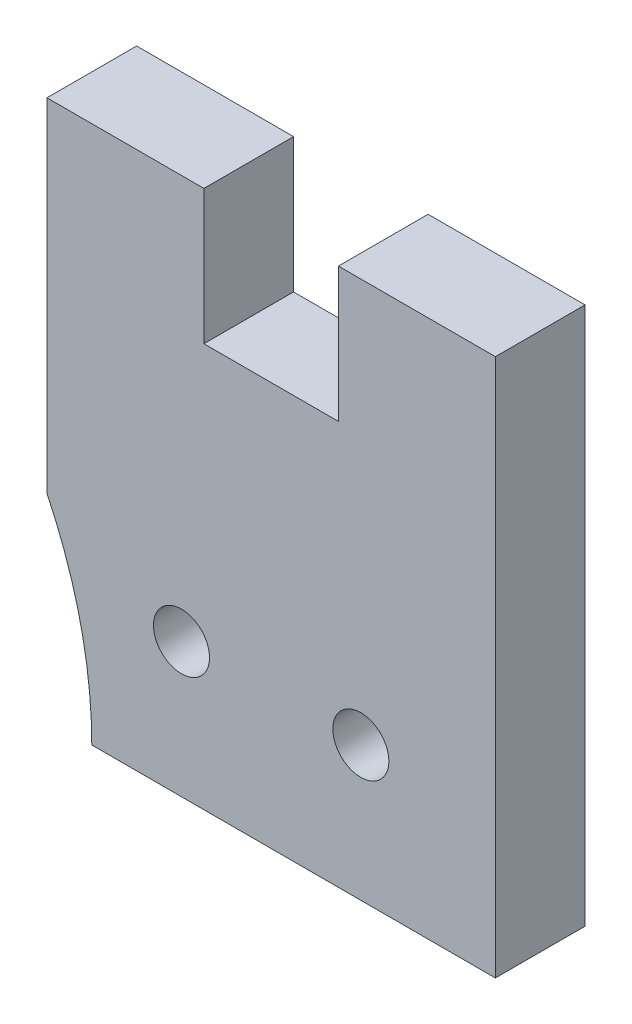
ISO-10303-21;
HEADER;
FILE_DESCRIPTION(('STEP AP214'),'2;1');
FILE_NAME('part.step','',(''),(''),'','','');
FILE_SCHEMA(('AUTOMOTIVE_DESIGN { 1 0 10303 214 1 1 1 1 }'));
ENDSEC;
DATA;
#1=APPLICATION_CONTEXT('core data for automotive mechanical design processes');
#2=APPLICATION_PROTOCOL_DEFINITION('international standard','automotive_design',2000,#1);
#3=PRODUCT_CONTEXT('',#1,'mechanical');
#4=PRODUCT('Part','Part','',(#3));
#5=PRODUCT_RELATED_PRODUCT_CATEGORY('part','',(#4));
#6=PRODUCT_DEFINITION_FORMATION('','',#4);
#7=PRODUCT_DEFINITION_CONTEXT('part definition',#1,'design');
#8=PRODUCT_DEFINITION('design','',#6,#7);
#9=PRODUCT_DEFINITION_SHAPE('','',#8);
#10=(LENGTH_UNIT() NAMED_UNIT(*) SI_UNIT(.MILLI.,.METRE.));
#11=(NAMED_UNIT(*) PLANE_ANGLE_UNIT() SI_UNIT($,.RADIAN.));
#12=(NAMED_UNIT(*) SI_UNIT($,.STERADIAN.) SOLID_ANGLE_UNIT());
#13=UNCERTAINTY_MEASURE_WITH_UNIT(LENGTH_MEASURE(1.E-05),#10,'distance_accuracy_value','');
#14=(GEOMETRIC_REPRESENTATION_CONTEXT(3) GLOBAL_UNCERTAINTY_ASSIGNED_CONTEXT((#13)) GLOBAL_UNIT_ASSIGNED_CONTEXT((#10,
#11,#12)) REPRESENTATION_CONTEXT('',''));
#15=CARTESIAN_POINT('',(0.,0.,0.));
#16=DIRECTION('',(0.,0.,1.));
#17=DIRECTION('',(1.,0.,0.));
#18=AXIS2_PLACEMENT_3D('',#15,#16,#17);
#19=CARTESIAN_POINT('',(2.5,9.,-1.));
#20=DIRECTION('',(1.,0.,0.));
#21=DIRECTION('',(0.,0.,-1.));
#22=AXIS2_PLACEMENT_3D('',#19,#20,#21);
#23=PLANE('',#22);
#24=DIRECTION('',(0.,0.,1.));
#25=VECTOR('',#24,1.);
#26=CARTESIAN_POINT('',(2.5,12.,-1.));
#27=LINE('',#26,#25);
#28=CARTESIAN_POINT('',(2.5,12.,-1.));
#29=VERTEX_POINT('',#28);
#30=CARTESIAN_POINT('',(2.5,12.,0.999999999999997));
#31=VERTEX_POINT('',#30);
#32=EDGE_CURVE('E36',#29,#31,#27,.T.);
#33=ORIENTED_EDGE('',*,*,#32,.T.);
#34=DIRECTION('',(0.,1.,0.));
#35=VECTOR('',#34,1.);
#36=CARTESIAN_POINT('',(2.5,9.,0.999999999999997));
#37=LINE('',#36,#35);
#38=CARTESIAN_POINT('',(2.5,9.,0.999999999999997));
#39=VERTEX_POINT('',#38);
#40=EDGE_CURVE('E103',#39,#31,#37,.T.);
#41=ORIENTED_EDGE('',*,*,#40,.F.);
#42=DIRECTION('',(0.,0.,1.));
#43=VECTOR('',#42,1.);
#44=CARTESIAN_POINT('',(2.5,9.,-1.));
#45=LINE('',#44,#43);
#46=CARTESIAN_POINT('',(2.5,9.,-1.));
#47=VERTEX_POINT('',#46);
#48=EDGE_CURVE('E11',#47,#39,#45,.T.);
#49=ORIENTED_EDGE('',*,*,#48,.F.);
#50=DIRECTION('',(0.,1.,0.));
#51=VECTOR('',#50,1.);
#52=CARTESIAN_POINT('',(2.5,9.,-1.));
#53=LINE('',#52,#51);
#54=EDGE_CURVE('E104',#47,#29,#53,.T.);
#55=ORIENTED_EDGE('',*,*,#54,.T.);
#56=EDGE_LOOP('',(#33,#41,#49,#55));
#57=FACE_BOUND('',#56,.T.);
#58=ADVANCED_FACE('F33',(#57),#23,.T.);
#59=CARTESIAN_POINT('',(5.5,9.,-1.));
#60=DIRECTION('',(0.,1.,0.));
#61=DIRECTION('',(0.,0.,1.));
#62=AXIS2_PLACEMENT_3D('',#59,#60,#61);
#63=PLANE('',#62);
#64=ORIENTED_EDGE('',*,*,#48,.T.);
#65=DIRECTION('',(-1.,0.,0.));
#66=VECTOR('',#65,1.);
#67=CARTESIAN_POINT('',(5.5,9.,0.999999999999997));
#68=LINE('',#67,#66);
#69=CARTESIAN_POINT('',(5.5,9.,0.999999999999997));
#70=VERTEX_POINT('',#69);
#71=EDGE_CURVE('E121',#70,#39,#68,.T.);
#72=ORIENTED_EDGE('',*,*,#71,.F.);
#73=DIRECTION('',(0.,0.,1.));
#74=VECTOR('',#73,1.);
#75=CARTESIAN_POINT('',(5.5,9.,-1.));
#76=LINE('',#75,#74);
#77=CARTESIAN_POINT('',(5.5,9.,-1.));
#78=VERTEX_POINT('',#77);
#79=EDGE_CURVE('E41',#78,#70,#76,.T.);
#80=ORIENTED_EDGE('',*,*,#79,.F.);
#81=DIRECTION('',(-1.,0.,0.));
#82=VECTOR('',#81,1.);
#83=CARTESIAN_POINT('',(5.5,9.,-1.));
#84=LINE('',#83,#82);
#85=EDGE_CURVE('E109',#78,#47,#84,.T.);
#86=ORIENTED_EDGE('',*,*,#85,.T.);
#87=EDGE_LOOP('',(#64,#72,#80,#86));
#88=FACE_BOUND('',#87,.T.);
#89=ADVANCED_FACE('F202',(#88),#63,.T.);
#90=CARTESIAN_POINT('',(5.5,12.,-1.));
#91=DIRECTION('',(-1.,0.,0.));
#92=DIRECTION('',(0.,0.,1.));
#93=AXIS2_PLACEMENT_3D('',#90,#91,#92);
#94=PLANE('',#93);
#95=ORIENTED_EDGE('',*,*,#79,.T.);
#96=DIRECTION('',(0.,-1.,0.));
#97=VECTOR('',#96,1.);
#98=CARTESIAN_POINT('',(5.5,12.,0.999999999999997));
#99=LINE('',#98,#97);
#100=CARTESIAN_POINT('',(5.5,12.,0.999999999999997));
#101=VERTEX_POINT('',#100);
#102=EDGE_CURVE('E142',#101,#70,#99,.T.);
#103=ORIENTED_EDGE('',*,*,#102,.F.);
#104=DIRECTION('',(0.,0.,1.));
#105=VECTOR('',#104,1.);
#106=CARTESIAN_POINT('',(5.5,12.,-1.));
#107=LINE('',#106,#105);
#108=CARTESIAN_POINT('',(5.5,12.,-1.));
#109=VERTEX_POINT('',#108);
#110=EDGE_CURVE('E166',#109,#101,#107,.T.);
#111=ORIENTED_EDGE('',*,*,#110,.F.);
#112=DIRECTION('',(0.,-1.,0.));
#113=VECTOR('',#112,1.);
#114=CARTESIAN_POINT('',(5.5,12.,-1.));
#115=LINE('',#114,#113);
#116=EDGE_CURVE('E162',#109,#78,#115,.T.);
#117=ORIENTED_EDGE('',*,*,#116,.T.);
#118=EDGE_LOOP('',(#95,#103,#111,#117));
#119=FACE_BOUND('',#118,.T.);
#120=ADVANCED_FACE('F200',(#119),#94,.T.);
#121=CARTESIAN_POINT('',(9.,12.,-1.));
#122=DIRECTION('',(0.,1.,0.));
#123=DIRECTION('',(0.,0.,1.));
#124=AXIS2_PLACEMENT_3D('',#121,#122,#123);
#125=PLANE('',#124);
#126=ORIENTED_EDGE('',*,*,#110,.T.);
#127=DIRECTION('',(-1.,0.,0.));
#128=VECTOR('',#127,1.);
#129=CARTESIAN_POINT('',(9.,12.,0.999999999999997));
#130=LINE('',#129,#128);
#131=CARTESIAN_POINT('',(9.,12.,0.999999999999997));
#132=VERTEX_POINT('',#131);
#133=EDGE_CURVE('E139',#132,#101,#130,.T.);
#134=ORIENTED_EDGE('',*,*,#133,.F.);
#135=DIRECTION('',(0.,0.,1.));
#136=VECTOR('',#135,1.);
#137=CARTESIAN_POINT('',(9.,12.,-1.));
#138=LINE('',#137,#136);
#139=CARTESIAN_POINT('',(9.,12.,-1.));
#140=VERTEX_POINT('',#139);
#141=EDGE_CURVE('E168',#140,#132,#138,.T.);
#142=ORIENTED_EDGE('',*,*,#141,.F.);
#143=DIRECTION('',(-1.,0.,0.));
#144=VECTOR('',#143,1.);
#145=CARTESIAN_POINT('',(9.,12.,-1.));
#146=LINE('',#145,#144);
#147=EDGE_CURVE('E159',#140,#109,#146,.T.);
#148=ORIENTED_EDGE('',*,*,#147,.T.);
#149=EDGE_LOOP('',(#126,#134,#142,#148));
#150=FACE_BOUND('',#149,.T.);
#151=ADVANCED_FACE('F194',(#150),#125,.T.);
#152=CARTESIAN_POINT('',(9.,0.,-1.));
#153=DIRECTION('',(1.,0.,0.));
#154=DIRECTION('',(0.,0.,-1.));
#155=AXIS2_PLACEMENT_3D('',#152,#153,#154);
#156=PLANE('',#155);
#157=ORIENTED_EDGE('',*,*,#141,.T.);
#158=DIRECTION('',(0.,1.,0.));
#159=VECTOR('',#158,1.);
#160=CARTESIAN_POINT('',(9.,0.,0.999999999999997));
#161=LINE('',#160,#159);
#162=CARTESIAN_POINT('',(9.,0.,0.999999999999997));
#163=VERTEX_POINT('',#162);
#164=EDGE_CURVE('E136',#163,#132,#161,.T.);
#165=ORIENTED_EDGE('',*,*,#164,.F.);
#166=DIRECTION('',(0.,0.,1.));
#167=VECTOR('',#166,1.);
#168=CARTESIAN_POINT('',(9.,0.,-1.));
#169=LINE('',#168,#167);
#170=CARTESIAN_POINT('',(9.,0.,-1.));
#171=VERTEX_POINT('',#170);
#172=EDGE_CURVE('E170',#171,#163,#169,.T.);
#173=ORIENTED_EDGE('',*,*,#172,.F.);
#174=DIRECTION('',(0.,1.,0.));
#175=VECTOR('',#174,1.);
#176=CARTESIAN_POINT('',(9.,0.,-1.));
#177=LINE('',#176,#175);
#178=EDGE_CURVE('E156',#171,#140,#177,.T.);
#179=ORIENTED_EDGE('',*,*,#178,.T.);
#180=EDGE_LOOP('',(#157,#165,#173,#179));
#181=FACE_BOUND('',#180,.T.);
#182=ADVANCED_FACE('F190',(#181),#156,.T.);
#183=CARTESIAN_POINT('',(0.,0.,-1.));
#184=DIRECTION('',(0.,-1.,0.));
#185=DIRECTION('',(0.,0.,-1.));
#186=AXIS2_PLACEMENT_3D('',#183,#184,#185);
#187=PLANE('',#186);
#188=ORIENTED_EDGE('',*,*,#172,.T.);
#189=DIRECTION('',(1.,0.,0.));
#190=VECTOR('',#189,1.);
#191=CARTESIAN_POINT('',(0.,0.,0.999999999999997));
#192=LINE('',#191,#190);
#193=CARTESIAN_POINT('',(0.,0.,0.999999999999997));
#194=VERTEX_POINT('',#193);
#195=EDGE_CURVE('E133',#194,#163,#192,.T.);
#196=ORIENTED_EDGE('',*,*,#195,.F.);
#197=DIRECTION('',(0.,0.,1.));
#198=VECTOR('',#197,1.);
#199=CARTESIAN_POINT('',(0.,0.,-1.));
#200=LINE('',#199,#198);
#201=CARTESIAN_POINT('',(0.,0.,-1.));
#202=VERTEX_POINT('',#201);
#203=EDGE_CURVE('E172',#202,#194,#200,.T.);
#204=ORIENTED_EDGE('',*,*,#203,.F.);
#205=DIRECTION('',(1.,0.,0.));
#206=VECTOR('',#205,1.);
#207=CARTESIAN_POINT('',(0.,0.,-1.));
#208=LINE('',#207,#206);
#209=EDGE_CURVE('E153',#202,#171,#208,.T.);
#210=ORIENTED_EDGE('',*,*,#209,.T.);
#211=EDGE_LOOP('',(#188,#196,#204,#210));
#212=FACE_BOUND('',#211,.T.);
#213=ADVANCED_FACE('F186',(#212),#187,.T.);
#214=CARTESIAN_POINT('',(-10.,0.,-1.));
#215=DIRECTION('',(0.,0.,1.));
#216=DIRECTION('',(1.,0.,0.));
#217=AXIS2_PLACEMENT_3D('',#214,#215,#216);
#218=CYLINDRICAL_SURFACE('',#217,10.);
#219=ORIENTED_EDGE('',*,*,#203,.T.);
#220=CARTESIAN_POINT('',(-10.,0.,0.999999999999997));
#221=DIRECTION('',(0.,0.,1.));
#222=DIRECTION('',(1.,0.,0.));
#223=AXIS2_PLACEMENT_3D('',#220,#221,#222);
#224=CIRCLE('',#223,10.);
#225=CARTESIAN_POINT('',(-1.,4.35889894354067,0.999999999999997));
#226=VERTEX_POINT('',#225);
#227=EDGE_CURVE('E130',#194,#226,#224,.T.);
#228=ORIENTED_EDGE('',*,*,#227,.T.);
#229=DIRECTION('',(0.,0.,1.));
#230=VECTOR('',#229,1.);
#231=CARTESIAN_POINT('',(-1.,4.35889894354067,-1.));
#232=LINE('',#231,#230);
#233=CARTESIAN_POINT('',(-1.,4.35889894354067,-1.));
#234=VERTEX_POINT('',#233);
#235=EDGE_CURVE('E174',#234,#226,#232,.T.);
#236=ORIENTED_EDGE('',*,*,#235,.F.);
#237=CARTESIAN_POINT('',(-10.,0.,-1.));
#238=DIRECTION('',(0.,0.,1.));
#239=DIRECTION('',(1.,0.,0.));
#240=AXIS2_PLACEMENT_3D('',#237,#238,#239);
#241=CIRCLE('',#240,10.);
#242=EDGE_CURVE('E151',#202,#234,#241,.T.);
#243=ORIENTED_EDGE('',*,*,#242,.F.);
#244=EDGE_LOOP('',(#219,#228,#236,#243));
#245=FACE_BOUND('',#244,.T.);
#246=ADVANCED_FACE('F182',(#245),#218,.F.);
#247=CARTESIAN_POINT('',(-1.,12.,-1.));
#248=DIRECTION('',(-1.,0.,0.));
#249=DIRECTION('',(0.,-1.,0.));
#250=AXIS2_PLACEMENT_3D('',#247,#248,#249);
#251=PLANE('',#250);
#252=ORIENTED_EDGE('',*,*,#235,.T.);
#253=DIRECTION('',(0.,-1.,0.));
#254=VECTOR('',#253,1.);
#255=CARTESIAN_POINT('',(-1.,12.,0.999999999999997));
#256=LINE('',#255,#254);
#257=CARTESIAN_POINT('',(-1.,12.,0.999999999999997));
#258=VERTEX_POINT('',#257);
#259=EDGE_CURVE('E116',#258,#226,#256,.T.);
#260=ORIENTED_EDGE('',*,*,#259,.F.);
#261=DIRECTION('',(0.,0.,1.));
#262=VECTOR('',#261,1.);
#263=CARTESIAN_POINT('',(-1.,12.,-1.));
#264=LINE('',#263,#262);
#265=CARTESIAN_POINT('',(-1.,12.,-1.));
#266=VERTEX_POINT('',#265);
#267=EDGE_CURVE('E108',#266,#258,#264,.T.);
#268=ORIENTED_EDGE('',*,*,#267,.F.);
#269=DIRECTION('',(0.,-1.,0.));
#270=VECTOR('',#269,1.);
#271=CARTESIAN_POINT('',(-1.,12.,-1.));
#272=LINE('',#271,#270);
#273=EDGE_CURVE('E148',#266,#234,#272,.T.);
#274=ORIENTED_EDGE('',*,*,#273,.T.);
#275=EDGE_LOOP('',(#252,#260,#268,#274));
#276=FACE_BOUND('',#275,.T.);
#277=ADVANCED_FACE('F177',(#276),#251,.T.);
#278=CARTESIAN_POINT('',(2.5,12.,-1.));
#279=DIRECTION('',(0.,1.,0.));
#280=DIRECTION('',(0.,0.,1.));
#281=AXIS2_PLACEMENT_3D('',#278,#279,#280);
#282=PLANE('',#281);
#283=ORIENTED_EDGE('',*,*,#267,.T.);
#284=DIRECTION('',(-1.,0.,0.));
#285=VECTOR('',#284,1.);
#286=CARTESIAN_POINT('',(2.5,12.,0.999999999999997));
#287=LINE('',#286,#285);
#288=EDGE_CURVE('E111',#31,#258,#287,.T.);
#289=ORIENTED_EDGE('',*,*,#288,.F.);
#290=ORIENTED_EDGE('',*,*,#32,.F.);
#291=DIRECTION('',(-1.,0.,0.));
#292=VECTOR('',#291,1.);
#293=CARTESIAN_POINT('',(2.5,12.,-1.));
#294=LINE('',#293,#292);
#295=EDGE_CURVE('E146',#29,#266,#294,.T.);
#296=ORIENTED_EDGE('',*,*,#295,.T.);
#297=EDGE_LOOP('',(#283,#289,#290,#296));
#298=FACE_BOUND('',#297,.T.);
#299=ADVANCED_FACE('F112',(#298),#282,.T.);
#300=CARTESIAN_POINT('',(-10.,0.,-1.));
#301=DIRECTION('',(0.,0.,1.));
#302=DIRECTION('',(1.,0.,0.));
#303=AXIS2_PLACEMENT_3D('',#300,#301,#302);
#304=PLANE('',#303);
#305=CARTESIAN_POINT('',(2.,3.,-1.));
#306=DIRECTION('',(0.,0.,1.));
#307=DIRECTION('',(1.,0.,0.));
#308=AXIS2_PLACEMENT_3D('',#305,#306,#307);
#309=CIRCLE('',#308,0.625);
#310=CARTESIAN_POINT('',(2.625,3.,-1.));
#311=VERTEX_POINT('',#310);
#312=EDGE_CURVE('E122',#311,#311,#309,.T.);
#313=ORIENTED_EDGE('',*,*,#312,.T.);
#314=EDGE_LOOP('',(#313));
#315=FACE_BOUND('',#314,.T.);
#316=CARTESIAN_POINT('',(6.,3.,-1.));
#317=DIRECTION('',(0.,0.,1.));
#318=DIRECTION('',(1.,0.,0.));
#319=AXIS2_PLACEMENT_3D('',#316,#317,#318);
#320=CIRCLE('',#319,0.625);
#321=CARTESIAN_POINT('',(6.625,3.,-1.));
#322=VERTEX_POINT('',#321);
#323=EDGE_CURVE('E125',#322,#322,#320,.T.);
#324=ORIENTED_EDGE('',*,*,#323,.T.);
#325=EDGE_LOOP('',(#324));
#326=FACE_BOUND('',#325,.T.);
#327=ORIENTED_EDGE('',*,*,#54,.F.);
#328=ORIENTED_EDGE('',*,*,#85,.F.);
#329=ORIENTED_EDGE('',*,*,#116,.F.);
#330=ORIENTED_EDGE('',*,*,#147,.F.);
#331=ORIENTED_EDGE('',*,*,#178,.F.);
#332=ORIENTED_EDGE('',*,*,#209,.F.);
#333=ORIENTED_EDGE('',*,*,#242,.T.);
#334=ORIENTED_EDGE('',*,*,#273,.F.);
#335=ORIENTED_EDGE('',*,*,#295,.F.);
#336=EDGE_LOOP('',(#327,#328,#329,#330,#331,#332,#333,#334,#335));
#337=FACE_BOUND('',#336,.T.);
#338=ADVANCED_FACE('F197',(#315,#326,#337),#304,.F.);
#339=CARTESIAN_POINT('',(-10.,0.,0.999999999999997));
#340=DIRECTION('',(0.,0.,1.));
#341=DIRECTION('',(1.,0.,0.));
#342=AXIS2_PLACEMENT_3D('',#339,#340,#341);
#343=PLANE('',#342);
#344=CARTESIAN_POINT('',(2.,3.,0.999999999999997));
#345=DIRECTION('',(0.,0.,1.));
#346=DIRECTION('',(1.,0.,0.));
#347=AXIS2_PLACEMENT_3D('',#344,#345,#346);
#348=CIRCLE('',#347,0.625);
#349=CARTESIAN_POINT('',(2.625,3.,0.999999999999997));
#350=VERTEX_POINT('',#349);
#351=EDGE_CURVE('E237',#350,#350,#348,.T.);
#352=ORIENTED_EDGE('',*,*,#351,.F.);
#353=EDGE_LOOP('',(#352));
#354=FACE_BOUND('',#353,.T.);
#355=CARTESIAN_POINT('',(6.,3.,0.999999999999997));
#356=DIRECTION('',(0.,0.,1.));
#357=DIRECTION('',(1.,0.,0.));
#358=AXIS2_PLACEMENT_3D('',#355,#356,#357);
#359=CIRCLE('',#358,0.625);
#360=CARTESIAN_POINT('',(6.625,3.,0.999999999999997));
#361=VERTEX_POINT('',#360);
#362=EDGE_CURVE('E239',#361,#361,#359,.T.);
#363=ORIENTED_EDGE('',*,*,#362,.F.);
#364=EDGE_LOOP('',(#363));
#365=FACE_BOUND('',#364,.T.);
#366=ORIENTED_EDGE('',*,*,#40,.T.);
#367=ORIENTED_EDGE('',*,*,#288,.T.);
#368=ORIENTED_EDGE('',*,*,#259,.T.);
#369=ORIENTED_EDGE('',*,*,#227,.F.);
#370=ORIENTED_EDGE('',*,*,#195,.T.);
#371=ORIENTED_EDGE('',*,*,#164,.T.);
#372=ORIENTED_EDGE('',*,*,#133,.T.);
#373=ORIENTED_EDGE('',*,*,#102,.T.);
#374=ORIENTED_EDGE('',*,*,#71,.T.);
#375=EDGE_LOOP('',(#366,#367,#368,#369,#370,#371,#372,#373,#374));
#376=FACE_BOUND('',#375,.T.);
#377=ADVANCED_FACE('F119',(#354,#365,#376),#343,.T.);
#378=CARTESIAN_POINT('',(6.,3.,-9.00000000000001));
#379=DIRECTION('',(0.,0.,1.));
#380=DIRECTION('',(1.,0.,0.));
#381=AXIS2_PLACEMENT_3D('',#378,#379,#380);
#382=CYLINDRICAL_SURFACE('',#381,0.625);
#383=ORIENTED_EDGE('',*,*,#362,.T.);
#384=EDGE_LOOP('',(#383));
#385=FACE_BOUND('',#384,.T.);
#386=ORIENTED_EDGE('',*,*,#323,.F.);
#387=EDGE_LOOP('',(#386));
#388=FACE_BOUND('',#387,.T.);
#389=ADVANCED_FACE('F230',(#385,#388),#382,.F.);
#390=CARTESIAN_POINT('',(2.,3.,-9.00000000000001));
#391=DIRECTION('',(0.,0.,1.));
#392=DIRECTION('',(1.,0.,0.));
#393=AXIS2_PLACEMENT_3D('',#390,#391,#392);
#394=CYLINDRICAL_SURFACE('',#393,0.625);
#395=ORIENTED_EDGE('',*,*,#351,.T.);
#396=EDGE_LOOP('',(#395));
#397=FACE_BOUND('',#396,.T.);
#398=ORIENTED_EDGE('',*,*,#312,.F.);
#399=EDGE_LOOP('',(#398));
#400=FACE_BOUND('',#399,.T.);
#401=ADVANCED_FACE('F247',(#397,#400),#394,.F.);
#402=CLOSED_SHELL('',(#58,#89,#120,#151,#182,#213,#246,#277,#299,#338,#377,#389,#401));
#403=MANIFOLD_SOLID_BREP('B2',#402);
#404=ADVANCED_BREP_SHAPE_REPRESENTATION('',(#18,#403),#14);
#405=SHAPE_DEFINITION_REPRESENTATION(#9,#404);
ENDSEC;
END-ISO-10303-21;
